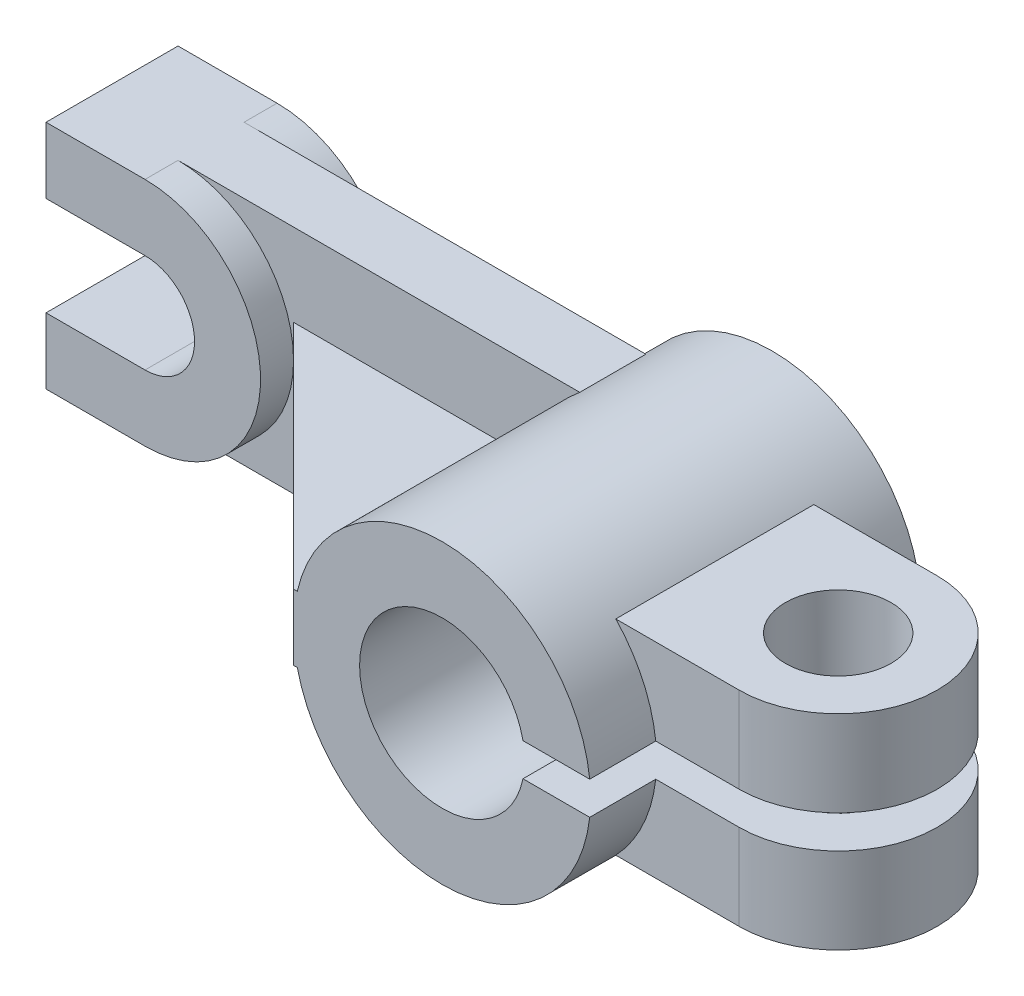
ISO-10303-21;
HEADER;
FILE_DESCRIPTION(('STEP AP214'),'2;1');
FILE_NAME('part.step','',(''),(''),'','','');
FILE_SCHEMA(('AUTOMOTIVE_DESIGN { 1 0 10303 214 1 1 1 1 }'));
ENDSEC;
DATA;
#1=APPLICATION_CONTEXT('core data for automotive mechanical design processes');
#2=APPLICATION_PROTOCOL_DEFINITION('international standard','automotive_design',2000,#1);
#3=PRODUCT_CONTEXT('',#1,'mechanical');
#4=PRODUCT('Part','Part','',(#3));
#5=PRODUCT_RELATED_PRODUCT_CATEGORY('part','',(#4));
#6=PRODUCT_DEFINITION_FORMATION('','',#4);
#7=PRODUCT_DEFINITION_CONTEXT('part definition',#1,'design');
#8=PRODUCT_DEFINITION('design','',#6,#7);
#9=PRODUCT_DEFINITION_SHAPE('','',#8);
#10=(LENGTH_UNIT() NAMED_UNIT(*) SI_UNIT(.MILLI.,.METRE.));
#11=(NAMED_UNIT(*) PLANE_ANGLE_UNIT() SI_UNIT($,.RADIAN.));
#12=(NAMED_UNIT(*) SI_UNIT($,.STERADIAN.) SOLID_ANGLE_UNIT());
#13=UNCERTAINTY_MEASURE_WITH_UNIT(LENGTH_MEASURE(1.E-05),#10,'distance_accuracy_value','');
#14=(GEOMETRIC_REPRESENTATION_CONTEXT(3) GLOBAL_UNCERTAINTY_ASSIGNED_CONTEXT((#13)) GLOBAL_UNIT_ASSIGNED_CONTEXT((#10,
#11,#12)) REPRESENTATION_CONTEXT('',''));
#15=CARTESIAN_POINT('',(0.,0.,0.));
#16=DIRECTION('',(0.,0.,1.));
#17=DIRECTION('',(1.,0.,0.));
#18=AXIS2_PLACEMENT_3D('',#15,#16,#17);
#19=CARTESIAN_POINT('',(-0.001000000000001,2.,35.));
#20=DIRECTION('',(0.,0.,-1.));
#21=DIRECTION('',(-1.,0.,0.));
#22=AXIS2_PLACEMENT_3D('',#19,#20,#21);
#23=PLANE('',#22);
#24=CARTESIAN_POINT('',(90.,17.5,35.));
#25=DIRECTION('',(0.,0.,-1.));
#26=DIRECTION('',(-1.,0.,0.));
#27=AXIS2_PLACEMENT_3D('',#24,#25,#26);
#28=CIRCLE('',#27,22.5);
#29=CARTESIAN_POINT('',(106.3095064303,33.,35.));
#30=VERTEX_POINT('',#29);
#31=CARTESIAN_POINT('',(112.360679774998,20.,35.));
#32=VERTEX_POINT('',#31);
#33=EDGE_CURVE('E422',#30,#32,#28,.T.);
#34=ORIENTED_EDGE('',*,*,#33,.T.);
#35=DIRECTION('',(1.,0.,0.));
#36=VECTOR('',#35,1.);
#37=CARTESIAN_POINT('',(-0.001000000000001,20.,35.));
#38=LINE('',#37,#36);
#39=CARTESIAN_POINT('',(125.,20.,35.));
#40=VERTEX_POINT('',#39);
#41=EDGE_CURVE('E418',#32,#40,#38,.T.);
#42=ORIENTED_EDGE('',*,*,#41,.T.);
#43=DIRECTION('',(0.,1.,0.));
#44=VECTOR('',#43,1.);
#45=CARTESIAN_POINT('',(125.,2.,35.));
#46=LINE('',#45,#44);
#47=CARTESIAN_POINT('',(125.,33.,35.));
#48=VERTEX_POINT('',#47);
#49=EDGE_CURVE('E447',#40,#48,#46,.T.);
#50=ORIENTED_EDGE('',*,*,#49,.T.);
#51=DIRECTION('',(-1.,0.,0.));
#52=VECTOR('',#51,1.);
#53=CARTESIAN_POINT('',(112.5,33.,35.));
#54=LINE('',#53,#52);
#55=EDGE_CURVE('E448',#48,#30,#54,.T.);
#56=ORIENTED_EDGE('',*,*,#55,.T.);
#57=EDGE_LOOP('',(#34,#42,#50,#56));
#58=FACE_BOUND('',#57,.T.);
#59=ADVANCED_FACE('F39',(#58),#23,.F.);
#60=CARTESIAN_POINT('',(-0.001000000000001,17.5,5.));
#61=DIRECTION('',(0.,0.,1.));
#62=DIRECTION('',(1.,0.,0.));
#63=AXIS2_PLACEMENT_3D('',#60,#61,#62);
#64=PLANE('',#63);
#65=DIRECTION('',(0.,1.,0.));
#66=VECTOR('',#65,1.);
#67=CARTESIAN_POINT('',(125.,2.,5.));
#68=LINE('',#67,#66);
#69=CARTESIAN_POINT('',(125.,20.,5.));
#70=VERTEX_POINT('',#69);
#71=CARTESIAN_POINT('',(125.,33.,5.));
#72=VERTEX_POINT('',#71);
#73=EDGE_CURVE('E461',#70,#72,#68,.T.);
#74=ORIENTED_EDGE('',*,*,#73,.F.);
#75=DIRECTION('',(-1.,0.,0.));
#76=VECTOR('',#75,1.);
#77=CARTESIAN_POINT('',(-0.001000000000001,20.,5.));
#78=LINE('',#77,#76);
#79=CARTESIAN_POINT('',(112.360679774998,20.,5.));
#80=VERTEX_POINT('',#79);
#81=EDGE_CURVE('E57',#70,#80,#78,.T.);
#82=ORIENTED_EDGE('',*,*,#81,.T.);
#83=CARTESIAN_POINT('',(90.,17.5,5.));
#84=DIRECTION('',(0.,0.,1.));
#85=DIRECTION('',(1.,0.,0.));
#86=AXIS2_PLACEMENT_3D('',#83,#84,#85);
#87=CIRCLE('',#86,22.5);
#88=CARTESIAN_POINT('',(106.3095064303,33.,5.));
#89=VERTEX_POINT('',#88);
#90=EDGE_CURVE('E426',#80,#89,#87,.T.);
#91=ORIENTED_EDGE('',*,*,#90,.T.);
#92=DIRECTION('',(1.,0.,0.));
#93=VECTOR('',#92,1.);
#94=CARTESIAN_POINT('',(125.,33.,5.));
#95=LINE('',#94,#93);
#96=EDGE_CURVE('E439',#89,#72,#95,.T.);
#97=ORIENTED_EDGE('',*,*,#96,.T.);
#98=EDGE_LOOP('',(#74,#82,#91,#97));
#99=FACE_BOUND('',#98,.T.);
#100=ADVANCED_FACE('F598',(#99),#64,.F.);
#101=CARTESIAN_POINT('',(125.,2.,20.));
#102=DIRECTION('',(0.,1.,0.));
#103=DIRECTION('',(0.,0.,1.));
#104=AXIS2_PLACEMENT_3D('',#101,#102,#103);
#105=CYLINDRICAL_SURFACE('',#104,15.);
#106=ORIENTED_EDGE('',*,*,#49,.F.);
#107=CARTESIAN_POINT('',(125.,20.,20.));
#108=DIRECTION('',(0.,1.,0.));
#109=DIRECTION('',(0.,0.,1.));
#110=AXIS2_PLACEMENT_3D('',#107,#108,#109);
#111=CIRCLE('',#110,15.);
#112=EDGE_CURVE('E413',#40,#70,#111,.T.);
#113=ORIENTED_EDGE('',*,*,#112,.T.);
#114=ORIENTED_EDGE('',*,*,#73,.T.);
#115=CARTESIAN_POINT('',(125.,33.,20.));
#116=DIRECTION('',(0.,-1.,0.));
#117=DIRECTION('',(0.,0.,-1.));
#118=AXIS2_PLACEMENT_3D('',#115,#116,#117);
#119=CIRCLE('',#118,15.);
#120=EDGE_CURVE('E452',#72,#48,#119,.T.);
#121=ORIENTED_EDGE('',*,*,#120,.T.);
#122=EDGE_LOOP('',(#106,#113,#114,#121));
#123=FACE_BOUND('',#122,.T.);
#124=ADVANCED_FACE('F581',(#123),#105,.T.);
#125=CARTESIAN_POINT('',(125.,2.,20.));
#126=DIRECTION('',(0.,1.,0.));
#127=DIRECTION('',(0.,0.,1.));
#128=AXIS2_PLACEMENT_3D('',#125,#126,#127);
#129=CYLINDRICAL_SURFACE('',#128,8.);
#130=CARTESIAN_POINT('',(125.,20.,20.));
#131=DIRECTION('',(0.,1.,0.));
#132=DIRECTION('',(0.,0.,1.));
#133=AXIS2_PLACEMENT_3D('',#130,#131,#132);
#134=CIRCLE('',#133,8.);
#135=CARTESIAN_POINT('',(125.,20.,28.));
#136=VERTEX_POINT('',#135);
#137=EDGE_CURVE('E43',#136,#136,#134,.T.);
#138=ORIENTED_EDGE('',*,*,#137,.F.);
#139=EDGE_LOOP('',(#138));
#140=FACE_BOUND('',#139,.T.);
#141=CARTESIAN_POINT('',(125.,33.,20.));
#142=DIRECTION('',(0.,-1.,0.));
#143=DIRECTION('',(0.,0.,-1.));
#144=AXIS2_PLACEMENT_3D('',#141,#142,#143);
#145=CIRCLE('',#144,8.);
#146=CARTESIAN_POINT('',(125.,33.,12.));
#147=VERTEX_POINT('',#146);
#148=EDGE_CURVE('E431',#147,#147,#145,.T.);
#149=ORIENTED_EDGE('',*,*,#148,.F.);
#150=EDGE_LOOP('',(#149));
#151=FACE_BOUND('',#150,.T.);
#152=ADVANCED_FACE('F578',(#140,#151),#129,.F.);
#153=CARTESIAN_POINT('',(90.,17.5,-5.));
#154=DIRECTION('',(0.,0.,1.));
#155=DIRECTION('',(1.,0.,0.));
#156=AXIS2_PLACEMENT_3D('',#153,#154,#155);
#157=CYLINDRICAL_SURFACE('',#156,22.5);
#158=DIRECTION('',(0.,0.,1.));
#159=VECTOR('',#158,1.);
#160=CARTESIAN_POINT('',(112.360679774998,20.,-5.));
#161=LINE('',#160,#159);
#162=CARTESIAN_POINT('',(112.360679774998,20.,45.));
#163=VERTEX_POINT('',#162);
#164=EDGE_CURVE('E272',#32,#163,#161,.T.);
#165=ORIENTED_EDGE('',*,*,#164,.F.);
#166=ORIENTED_EDGE('',*,*,#33,.F.);
#167=DIRECTION('',(0.,0.,1.));
#168=VECTOR('',#167,1.);
#169=CARTESIAN_POINT('',(106.3095064303,33.,-5.));
#170=LINE('',#169,#168);
#171=EDGE_CURVE('E427',#89,#30,#170,.T.);
#172=ORIENTED_EDGE('',*,*,#171,.F.);
#173=ORIENTED_EDGE('',*,*,#90,.F.);
#174=CARTESIAN_POINT('',(112.360679774998,20.,-5.));
#175=VERTEX_POINT('',#174);
#176=EDGE_CURVE('E267',#175,#80,#161,.T.);
#177=ORIENTED_EDGE('',*,*,#176,.F.);
#178=CARTESIAN_POINT('',(90.,17.5,-5.));
#179=DIRECTION('',(0.,0.,1.));
#180=DIRECTION('',(1.,0.,0.));
#181=AXIS2_PLACEMENT_3D('',#178,#179,#180);
#182=CIRCLE('',#181,22.5);
#183=CARTESIAN_POINT('',(112.360679774998,15.,-5.));
#184=VERTEX_POINT('',#183);
#185=EDGE_CURVE('E258',#175,#184,#182,.T.);
#186=ORIENTED_EDGE('',*,*,#185,.T.);
#187=DIRECTION('',(0.,0.,1.));
#188=VECTOR('',#187,1.);
#189=CARTESIAN_POINT('',(112.360679774998,15.,-5.));
#190=LINE('',#189,#188);
#191=CARTESIAN_POINT('',(112.360679774998,15.,5.));
#192=VERTEX_POINT('',#191);
#193=EDGE_CURVE('E236',#184,#192,#190,.T.);
#194=ORIENTED_EDGE('',*,*,#193,.T.);
#195=CARTESIAN_POINT('',(90.,17.5,5.));
#196=DIRECTION('',(0.,0.,1.));
#197=DIRECTION('',(1.,0.,0.));
#198=AXIS2_PLACEMENT_3D('',#195,#196,#197);
#199=CIRCLE('',#198,22.5);
#200=CARTESIAN_POINT('',(106.3095064303,2.,5.));
#201=VERTEX_POINT('',#200);
#202=EDGE_CURVE('E245',#201,#192,#199,.T.);
#203=ORIENTED_EDGE('',*,*,#202,.F.);
#204=DIRECTION('',(0.,0.,1.));
#205=VECTOR('',#204,1.);
#206=CARTESIAN_POINT('',(106.3095064303,2.,-5.));
#207=LINE('',#206,#205);
#208=CARTESIAN_POINT('',(106.3095064303,2.,35.));
#209=VERTEX_POINT('',#208);
#210=EDGE_CURVE('E253',#209,#201,#207,.F.);
#211=ORIENTED_EDGE('',*,*,#210,.F.);
#212=CARTESIAN_POINT('',(90.,17.5,35.));
#213=DIRECTION('',(0.,0.,-1.));
#214=DIRECTION('',(-1.,0.,0.));
#215=AXIS2_PLACEMENT_3D('',#212,#213,#214);
#216=CIRCLE('',#215,22.5);
#217=CARTESIAN_POINT('',(112.360679774998,15.,35.));
#218=VERTEX_POINT('',#217);
#219=EDGE_CURVE('E11',#209,#218,#216,.F.);
#220=ORIENTED_EDGE('',*,*,#219,.T.);
#221=CARTESIAN_POINT('',(112.360679774998,15.,45.));
#222=VERTEX_POINT('',#221);
#223=EDGE_CURVE('E261',#218,#222,#190,.T.);
#224=ORIENTED_EDGE('',*,*,#223,.T.);
#225=CARTESIAN_POINT('',(90.,17.5,45.));
#226=DIRECTION('',(0.,0.,1.));
#227=DIRECTION('',(1.,0.,0.));
#228=AXIS2_PLACEMENT_3D('',#225,#226,#227);
#229=CIRCLE('',#228,22.5);
#230=CARTESIAN_POINT('',(68.0625890315197,12.5,45.));
#231=VERTEX_POINT('',#230);
#232=EDGE_CURVE('E488',#231,#222,#229,.T.);
#233=ORIENTED_EDGE('',*,*,#232,.F.);
#234=DIRECTION('',(0.,0.,1.));
#235=VECTOR('',#234,1.);
#236=CARTESIAN_POINT('',(68.0625890315197,12.5,-5.));
#237=LINE('',#236,#235);
#238=CARTESIAN_POINT('',(68.0625890315197,12.5,10.));
#239=VERTEX_POINT('',#238);
#240=EDGE_CURVE('E500',#231,#239,#237,.F.);
#241=ORIENTED_EDGE('',*,*,#240,.T.);
#242=CARTESIAN_POINT('',(90.,17.5,10.));
#243=DIRECTION('',(0.,0.,-1.));
#244=DIRECTION('',(1.,0.,0.));
#245=AXIS2_PLACEMENT_3D('',#242,#243,#244);
#246=CIRCLE('',#245,22.5);
#247=CARTESIAN_POINT('',(75.857864376269,0.,10.));
#248=VERTEX_POINT('',#247);
#249=EDGE_CURVE('E368',#248,#239,#246,.T.);
#250=ORIENTED_EDGE('',*,*,#249,.F.);
#251=DIRECTION('',(0.,0.,-1.));
#252=VECTOR('',#251,1.);
#253=CARTESIAN_POINT('',(75.857864376269,0.,10.));
#254=LINE('',#253,#252);
#255=CARTESIAN_POINT('',(75.857864376269,0.,0.));
#256=VERTEX_POINT('',#255);
#257=EDGE_CURVE('E384',#248,#256,#254,.T.);
#258=ORIENTED_EDGE('',*,*,#257,.T.);
#259=CARTESIAN_POINT('',(90.,17.5,0.));
#260=DIRECTION('',(0.,0.,-1.));
#261=DIRECTION('',(1.,0.,0.));
#262=AXIS2_PLACEMENT_3D('',#259,#260,#261);
#263=CIRCLE('',#262,22.5);
#264=CARTESIAN_POINT('',(75.857864376269,35.,0.));
#265=VERTEX_POINT('',#264);
#266=EDGE_CURVE('E344',#256,#265,#263,.T.);
#267=ORIENTED_EDGE('',*,*,#266,.T.);
#268=DIRECTION('',(0.,0.,-1.));
#269=VECTOR('',#268,1.);
#270=CARTESIAN_POINT('',(75.857864376269,35.,10.));
#271=LINE('',#270,#269);
#272=CARTESIAN_POINT('',(75.857864376269,35.,10.));
#273=VERTEX_POINT('',#272);
#274=EDGE_CURVE('E49',#273,#265,#271,.T.);
#275=ORIENTED_EDGE('',*,*,#274,.F.);
#276=CARTESIAN_POINT('',(68.0625890315197,22.5,10.));
#277=VERTEX_POINT('',#276);
#278=EDGE_CURVE('E373',#277,#273,#246,.T.);
#279=ORIENTED_EDGE('',*,*,#278,.F.);
#280=DIRECTION('',(0.,0.,1.));
#281=VECTOR('',#280,1.);
#282=CARTESIAN_POINT('',(68.0625890315197,22.5,-5.));
#283=LINE('',#282,#281);
#284=CARTESIAN_POINT('',(68.0625890315197,22.5,45.));
#285=VERTEX_POINT('',#284);
#286=EDGE_CURVE('E509',#285,#277,#283,.F.);
#287=ORIENTED_EDGE('',*,*,#286,.F.);
#288=EDGE_CURVE('E489',#163,#285,#229,.T.);
#289=ORIENTED_EDGE('',*,*,#288,.F.);
#290=EDGE_LOOP('',(#165,#166,#172,#173,#177,#186,#194,#203,#211,#220,#224,#233,#241,#250,#258,
#267,#275,#279,#287,#289));
#291=FACE_BOUND('',#290,.T.);
#292=ADVANCED_FACE('F256',(#291),#157,.T.);
#293=CARTESIAN_POINT('',(90.,17.5,-5.));
#294=DIRECTION('',(0.,0.,1.));
#295=DIRECTION('',(1.,0.,0.));
#296=AXIS2_PLACEMENT_3D('',#293,#294,#295);
#297=CYLINDRICAL_SURFACE('',#296,12.5);
#298=DIRECTION('',(0.,0.,1.));
#299=VECTOR('',#298,1.);
#300=CARTESIAN_POINT('',(102.247448713916,20.,-5.));
#301=LINE('',#300,#299);
#302=CARTESIAN_POINT('',(102.247448713916,20.,-5.));
#303=VERTEX_POINT('',#302);
#304=CARTESIAN_POINT('',(102.247448713916,20.,45.));
#305=VERTEX_POINT('',#304);
#306=EDGE_CURVE('E273',#303,#305,#301,.T.);
#307=ORIENTED_EDGE('',*,*,#306,.T.);
#308=CARTESIAN_POINT('',(90.,17.5,45.));
#309=DIRECTION('',(0.,0.,-1.));
#310=DIRECTION('',(1.,0.,0.));
#311=AXIS2_PLACEMENT_3D('',#308,#309,#310);
#312=CIRCLE('',#311,12.5);
#313=CARTESIAN_POINT('',(102.247448713916,15.,45.));
#314=VERTEX_POINT('',#313);
#315=EDGE_CURVE('E481',#314,#305,#312,.T.);
#316=ORIENTED_EDGE('',*,*,#315,.F.);
#317=DIRECTION('',(0.,0.,1.));
#318=VECTOR('',#317,1.);
#319=CARTESIAN_POINT('',(102.247448713916,15.,-5.));
#320=LINE('',#319,#318);
#321=CARTESIAN_POINT('',(102.247448713916,15.,-5.));
#322=VERTEX_POINT('',#321);
#323=EDGE_CURVE('E260',#322,#314,#320,.T.);
#324=ORIENTED_EDGE('',*,*,#323,.F.);
#325=CARTESIAN_POINT('',(90.,17.5,-5.));
#326=DIRECTION('',(0.,0.,-1.));
#327=DIRECTION('',(1.,0.,0.));
#328=AXIS2_PLACEMENT_3D('',#325,#326,#327);
#329=CIRCLE('',#328,12.5);
#330=EDGE_CURVE('E520',#322,#303,#329,.T.);
#331=ORIENTED_EDGE('',*,*,#330,.T.);
#332=EDGE_LOOP('',(#307,#316,#324,#331));
#333=FACE_BOUND('',#332,.T.);
#334=ADVANCED_FACE('F536',(#333),#297,.F.);
#335=CARTESIAN_POINT('',(102.247448713916,15.,-5.));
#336=DIRECTION('',(0.,1.,0.));
#337=DIRECTION('',(0.,0.,1.));
#338=AXIS2_PLACEMENT_3D('',#335,#336,#337);
#339=PLANE('',#338);
#340=ORIENTED_EDGE('',*,*,#323,.T.);
#341=DIRECTION('',(-1.,0.,0.));
#342=VECTOR('',#341,1.);
#343=CARTESIAN_POINT('',(112.360679774998,15.,45.));
#344=LINE('',#343,#342);
#345=EDGE_CURVE('E492',#222,#314,#344,.T.);
#346=ORIENTED_EDGE('',*,*,#345,.F.);
#347=ORIENTED_EDGE('',*,*,#223,.F.);
#348=DIRECTION('',(-1.,0.,0.));
#349=VECTOR('',#348,1.);
#350=CARTESIAN_POINT('',(-0.00100000000000635,14.9999999999999,35.));
#351=LINE('',#350,#349);
#352=CARTESIAN_POINT('',(125.,15.,35.));
#353=VERTEX_POINT('',#352);
#354=EDGE_CURVE('E65',#353,#218,#351,.T.);
#355=ORIENTED_EDGE('',*,*,#354,.F.);
#356=CARTESIAN_POINT('',(125.,15.,20.));
#357=DIRECTION('',(0.,-1.,0.));
#358=DIRECTION('',(1.,0.,0.));
#359=AXIS2_PLACEMENT_3D('',#356,#357,#358);
#360=CIRCLE('',#359,15.);
#361=CARTESIAN_POINT('',(125.,15.,5.));
#362=VERTEX_POINT('',#361);
#363=EDGE_CURVE('E238',#362,#353,#360,.T.);
#364=ORIENTED_EDGE('',*,*,#363,.F.);
#365=DIRECTION('',(1.,0.,0.));
#366=VECTOR('',#365,1.);
#367=CARTESIAN_POINT('',(-0.000999999999999972,14.9999999999999,5.));
#368=LINE('',#367,#366);
#369=EDGE_CURVE('E229',#192,#362,#368,.T.);
#370=ORIENTED_EDGE('',*,*,#369,.F.);
#371=ORIENTED_EDGE('',*,*,#193,.F.);
#372=DIRECTION('',(-1.,0.,0.));
#373=VECTOR('',#372,1.);
#374=CARTESIAN_POINT('',(102.247448713916,15.,-5.));
#375=LINE('',#374,#373);
#376=EDGE_CURVE('E277',#184,#322,#375,.T.);
#377=ORIENTED_EDGE('',*,*,#376,.T.);
#378=EDGE_LOOP('',(#340,#346,#347,#355,#364,#370,#371,#377));
#379=FACE_BOUND('',#378,.T.);
#380=CARTESIAN_POINT('',(125.,15.,20.));
#381=DIRECTION('',(0.,-1.,0.));
#382=DIRECTION('',(1.,0.,0.));
#383=AXIS2_PLACEMENT_3D('',#380,#381,#382);
#384=CIRCLE('',#383,8.);
#385=CARTESIAN_POINT('',(133.,15.,20.));
#386=VERTEX_POINT('',#385);
#387=EDGE_CURVE('E401',#386,#386,#384,.T.);
#388=ORIENTED_EDGE('',*,*,#387,.T.);
#389=EDGE_LOOP('',(#388));
#390=FACE_BOUND('',#389,.T.);
#391=ADVANCED_FACE('F232',(#379,#390),#339,.T.);
#392=CARTESIAN_POINT('',(102.247448713916,20.,-5.));
#393=DIRECTION('',(0.,-1.,0.));
#394=DIRECTION('',(0.,0.,-1.));
#395=AXIS2_PLACEMENT_3D('',#392,#393,#394);
#396=PLANE('',#395);
#397=ORIENTED_EDGE('',*,*,#176,.T.);
#398=ORIENTED_EDGE('',*,*,#81,.F.);
#399=ORIENTED_EDGE('',*,*,#112,.F.);
#400=ORIENTED_EDGE('',*,*,#41,.F.);
#401=ORIENTED_EDGE('',*,*,#164,.T.);
#402=DIRECTION('',(1.,0.,0.));
#403=VECTOR('',#402,1.);
#404=CARTESIAN_POINT('',(102.247448713916,20.,45.));
#405=LINE('',#404,#403);
#406=EDGE_CURVE('E484',#305,#163,#405,.T.);
#407=ORIENTED_EDGE('',*,*,#406,.F.);
#408=ORIENTED_EDGE('',*,*,#306,.F.);
#409=DIRECTION('',(1.,0.,0.));
#410=VECTOR('',#409,1.);
#411=CARTESIAN_POINT('',(102.247448713916,20.,-5.));
#412=LINE('',#411,#410);
#413=EDGE_CURVE('E523',#303,#175,#412,.T.);
#414=ORIENTED_EDGE('',*,*,#413,.T.);
#415=EDGE_LOOP('',(#397,#398,#399,#400,#401,#407,#408,#414));
#416=FACE_BOUND('',#415,.T.);
#417=ORIENTED_EDGE('',*,*,#137,.T.);
#418=EDGE_LOOP('',(#417));
#419=FACE_BOUND('',#418,.T.);
#420=ADVANCED_FACE('F539',(#416,#419),#396,.T.);
#421=CARTESIAN_POINT('',(90.,17.5,10.));
#422=DIRECTION('',(0.,0.,1.));
#423=DIRECTION('',(1.,0.,0.));
#424=AXIS2_PLACEMENT_3D('',#421,#422,#423);
#425=PLANE('',#424);
#426=DIRECTION('',(-1.,0.,0.));
#427=VECTOR('',#426,1.);
#428=CARTESIAN_POINT('',(90.,22.5,10.));
#429=LINE('',#428,#427);
#430=CARTESIAN_POINT('',(32.5,22.5,10.));
#431=VERTEX_POINT('',#430);
#432=EDGE_CURVE('E512',#277,#431,#429,.T.);
#433=ORIENTED_EDGE('',*,*,#432,.F.);
#434=ORIENTED_EDGE('',*,*,#278,.T.);
#435=DIRECTION('',(-1.,0.,0.));
#436=VECTOR('',#435,1.);
#437=CARTESIAN_POINT('',(75.857864376269,35.,10.));
#438=LINE('',#437,#436);
#439=CARTESIAN_POINT('',(15.,35.,10.));
#440=VERTEX_POINT('',#439);
#441=EDGE_CURVE('E372',#273,#440,#438,.T.);
#442=ORIENTED_EDGE('',*,*,#441,.T.);
#443=CARTESIAN_POINT('',(15.,17.5,10.));
#444=DIRECTION('',(0.,0.,-1.));
#445=DIRECTION('',(1.,0.,0.));
#446=AXIS2_PLACEMENT_3D('',#443,#444,#445);
#447=CIRCLE('',#446,17.5);
#448=CARTESIAN_POINT('',(32.5,17.5,10.));
#449=VERTEX_POINT('',#448);
#450=EDGE_CURVE('E377',#440,#449,#447,.T.);
#451=ORIENTED_EDGE('',*,*,#450,.T.);
#452=DIRECTION('',(0.,-1.,0.));
#453=VECTOR('',#452,1.);
#454=CARTESIAN_POINT('',(32.5,17.5,10.));
#455=LINE('',#454,#453);
#456=EDGE_CURVE('E519',#431,#449,#455,.T.);
#457=ORIENTED_EDGE('',*,*,#456,.F.);
#458=EDGE_LOOP('',(#433,#434,#442,#451,#457));
#459=FACE_BOUND('',#458,.T.);
#460=ADVANCED_FACE('F554',(#459),#425,.T.);
#461=CARTESIAN_POINT('',(75.857864376269,35.,10.));
#462=DIRECTION('',(0.,-1.,0.));
#463=DIRECTION('',(1.,0.,0.));
#464=AXIS2_PLACEMENT_3D('',#461,#462,#463);
#465=PLANE('',#464);
#466=DIRECTION('',(-1.,0.,0.));
#467=VECTOR('',#466,1.);
#468=CARTESIAN_POINT('',(75.857864376269,35.,0.));
#469=LINE('',#468,#467);
#470=CARTESIAN_POINT('',(15.,35.,0.));
#471=VERTEX_POINT('',#470);
#472=EDGE_CURVE('E387',#265,#471,#469,.T.);
#473=ORIENTED_EDGE('',*,*,#472,.T.);
#474=DIRECTION('',(0.,0.,1.));
#475=VECTOR('',#474,1.);
#476=CARTESIAN_POINT('',(15.,35.,-5.));
#477=LINE('',#476,#475);
#478=CARTESIAN_POINT('',(15.,35.,-5.));
#479=VERTEX_POINT('',#478);
#480=EDGE_CURVE('E364',#479,#471,#477,.T.);
#481=ORIENTED_EDGE('',*,*,#480,.F.);
#482=DIRECTION('',(-1.,0.,0.));
#483=VECTOR('',#482,1.);
#484=CARTESIAN_POINT('',(0.,35.,-5.));
#485=LINE('',#484,#483);
#486=CARTESIAN_POINT('',(0.,35.,-5.));
#487=VERTEX_POINT('',#486);
#488=EDGE_CURVE('E312',#479,#487,#485,.T.);
#489=ORIENTED_EDGE('',*,*,#488,.T.);
#490=DIRECTION('',(0.,0.,1.));
#491=VECTOR('',#490,1.);
#492=CARTESIAN_POINT('',(0.,35.,-5.));
#493=LINE('',#492,#491);
#494=CARTESIAN_POINT('',(0.,35.,15.));
#495=VERTEX_POINT('',#494);
#496=EDGE_CURVE('E361',#487,#495,#493,.T.);
#497=ORIENTED_EDGE('',*,*,#496,.T.);
#498=DIRECTION('',(-1.,0.,0.));
#499=VECTOR('',#498,1.);
#500=CARTESIAN_POINT('',(0.,35.,15.));
#501=LINE('',#500,#499);
#502=CARTESIAN_POINT('',(15.,35.,15.));
#503=VERTEX_POINT('',#502);
#504=EDGE_CURVE('E281',#503,#495,#501,.T.);
#505=ORIENTED_EDGE('',*,*,#504,.F.);
#506=EDGE_CURVE('E339',#440,#503,#477,.T.);
#507=ORIENTED_EDGE('',*,*,#506,.F.);
#508=ORIENTED_EDGE('',*,*,#441,.F.);
#509=ORIENTED_EDGE('',*,*,#274,.T.);
#510=EDGE_LOOP('',(#473,#481,#489,#497,#505,#507,#508,#509));
#511=FACE_BOUND('',#510,.T.);
#512=ADVANCED_FACE('F41',(#511),#465,.F.);
#513=CARTESIAN_POINT('',(15.,0.,10.));
#514=DIRECTION('',(0.,1.,0.));
#515=DIRECTION('',(-1.,0.,0.));
#516=AXIS2_PLACEMENT_3D('',#513,#514,#515);
#517=PLANE('',#516);
#518=DIRECTION('',(1.,0.,0.));
#519=VECTOR('',#518,1.);
#520=CARTESIAN_POINT('',(15.,0.,0.));
#521=LINE('',#520,#519);
#522=CARTESIAN_POINT('',(15.,0.,0.));
#523=VERTEX_POINT('',#522);
#524=EDGE_CURVE('E393',#523,#256,#521,.T.);
#525=ORIENTED_EDGE('',*,*,#524,.T.);
#526=ORIENTED_EDGE('',*,*,#257,.F.);
#527=DIRECTION('',(1.,0.,0.));
#528=VECTOR('',#527,1.);
#529=CARTESIAN_POINT('',(15.,0.,10.));
#530=LINE('',#529,#528);
#531=CARTESIAN_POINT('',(15.,0.,10.));
#532=VERTEX_POINT('',#531);
#533=EDGE_CURVE('E381',#532,#248,#530,.T.);
#534=ORIENTED_EDGE('',*,*,#533,.F.);
#535=DIRECTION('',(0.,0.,1.));
#536=VECTOR('',#535,1.);
#537=CARTESIAN_POINT('',(15.,0.,-5.));
#538=LINE('',#537,#536);
#539=CARTESIAN_POINT('',(15.,0.,15.));
#540=VERTEX_POINT('',#539);
#541=EDGE_CURVE('E345',#532,#540,#538,.T.);
#542=ORIENTED_EDGE('',*,*,#541,.T.);
#543=DIRECTION('',(1.,0.,0.));
#544=VECTOR('',#543,1.);
#545=CARTESIAN_POINT('',(0.,0.,15.));
#546=LINE('',#545,#544);
#547=CARTESIAN_POINT('',(0.,0.,15.));
#548=VERTEX_POINT('',#547);
#549=EDGE_CURVE('E305',#548,#540,#546,.T.);
#550=ORIENTED_EDGE('',*,*,#549,.F.);
#551=DIRECTION('',(0.,0.,1.));
#552=VECTOR('',#551,1.);
#553=CARTESIAN_POINT('',(0.,0.,-5.));
#554=LINE('',#553,#552);
#555=CARTESIAN_POINT('',(0.,0.,-5.));
#556=VERTEX_POINT('',#555);
#557=EDGE_CURVE('E346',#556,#548,#554,.T.);
#558=ORIENTED_EDGE('',*,*,#557,.F.);
#559=DIRECTION('',(1.,0.,0.));
#560=VECTOR('',#559,1.);
#561=CARTESIAN_POINT('',(0.,0.,-5.));
#562=LINE('',#561,#560);
#563=CARTESIAN_POINT('',(15.,0.,-5.));
#564=VERTEX_POINT('',#563);
#565=EDGE_CURVE('E335',#556,#564,#562,.T.);
#566=ORIENTED_EDGE('',*,*,#565,.T.);
#567=EDGE_CURVE('E340',#564,#523,#538,.T.);
#568=ORIENTED_EDGE('',*,*,#567,.T.);
#569=EDGE_LOOP('',(#525,#526,#534,#542,#550,#558,#566,#568));
#570=FACE_BOUND('',#569,.T.);
#571=ADVANCED_FACE('F838',(#570),#517,.F.);
#572=CARTESIAN_POINT('',(32.5,12.5,10.));
#573=VERTEX_POINT('',#572);
#574=EDGE_CURVE('E515',#449,#573,#455,.T.);
#575=ORIENTED_EDGE('',*,*,#574,.F.);
#576=EDGE_CURVE('E376',#449,#532,#447,.T.);
#577=ORIENTED_EDGE('',*,*,#576,.T.);
#578=ORIENTED_EDGE('',*,*,#533,.T.);
#579=ORIENTED_EDGE('',*,*,#249,.T.);
#580=DIRECTION('',(-1.,0.,0.));
#581=VECTOR('',#580,1.);
#582=CARTESIAN_POINT('',(90.,12.5,10.));
#583=LINE('',#582,#581);
#584=EDGE_CURVE('E506',#239,#573,#583,.T.);
#585=ORIENTED_EDGE('',*,*,#584,.T.);
#586=EDGE_LOOP('',(#575,#577,#578,#579,#585));
#587=FACE_BOUND('',#586,.T.);
#588=ADVANCED_FACE('F827',(#587),#425,.T.);
#589=CARTESIAN_POINT('',(90.,17.5,0.));
#590=DIRECTION('',(0.,0.,1.));
#591=DIRECTION('',(1.,0.,0.));
#592=AXIS2_PLACEMENT_3D('',#589,#590,#591);
#593=PLANE('',#592);
#594=ORIENTED_EDGE('',*,*,#472,.F.);
#595=ORIENTED_EDGE('',*,*,#266,.F.);
#596=ORIENTED_EDGE('',*,*,#524,.F.);
#597=CARTESIAN_POINT('',(15.,17.5,0.));
#598=DIRECTION('',(0.,0.,-1.));
#599=DIRECTION('',(1.,0.,0.));
#600=AXIS2_PLACEMENT_3D('',#597,#598,#599);
#601=CIRCLE('',#600,17.5);
#602=EDGE_CURVE('E390',#471,#523,#601,.T.);
#603=ORIENTED_EDGE('',*,*,#602,.F.);
#604=EDGE_LOOP('',(#594,#595,#596,#603));
#605=FACE_BOUND('',#604,.T.);
#606=ADVANCED_FACE('F817',(#605),#593,.F.);
#607=CARTESIAN_POINT('',(15.,17.5,-5.));
#608=DIRECTION('',(0.,0.,1.));
#609=DIRECTION('',(1.,0.,0.));
#610=AXIS2_PLACEMENT_3D('',#607,#608,#609);
#611=CYLINDRICAL_SURFACE('',#610,17.5);
#612=ORIENTED_EDGE('',*,*,#602,.T.);
#613=ORIENTED_EDGE('',*,*,#567,.F.);
#614=CARTESIAN_POINT('',(15.,17.5,-5.));
#615=DIRECTION('',(0.,0.,1.));
#616=DIRECTION('',(1.,0.,0.));
#617=AXIS2_PLACEMENT_3D('',#614,#615,#616);
#618=CIRCLE('',#617,17.5);
#619=EDGE_CURVE('E309',#564,#479,#618,.T.);
#620=ORIENTED_EDGE('',*,*,#619,.T.);
#621=ORIENTED_EDGE('',*,*,#480,.T.);
#622=EDGE_LOOP('',(#612,#613,#620,#621));
#623=FACE_BOUND('',#622,.T.);
#624=ADVANCED_FACE('F805',(#623),#611,.T.);
#625=ORIENTED_EDGE('',*,*,#541,.F.);
#626=ORIENTED_EDGE('',*,*,#576,.F.);
#627=ORIENTED_EDGE('',*,*,#450,.F.);
#628=ORIENTED_EDGE('',*,*,#506,.T.);
#629=CARTESIAN_POINT('',(15.,17.5,15.));
#630=DIRECTION('',(0.,0.,1.));
#631=DIRECTION('',(1.,0.,0.));
#632=AXIS2_PLACEMENT_3D('',#629,#630,#631);
#633=CIRCLE('',#632,17.5);
#634=EDGE_CURVE('E265',#540,#503,#633,.T.);
#635=ORIENTED_EDGE('',*,*,#634,.F.);
#636=EDGE_LOOP('',(#625,#626,#627,#628,#635));
#637=FACE_BOUND('',#636,.T.);
#638=ADVANCED_FACE('F799',(#637),#611,.T.);
#639=CARTESIAN_POINT('',(0.,10.,-5.));
#640=DIRECTION('',(-1.,0.,0.));
#641=DIRECTION('',(0.,-1.,0.));
#642=AXIS2_PLACEMENT_3D('',#639,#640,#641);
#643=PLANE('',#642);
#644=ORIENTED_EDGE('',*,*,#557,.T.);
#645=DIRECTION('',(0.,-1.,0.));
#646=VECTOR('',#645,1.);
#647=CARTESIAN_POINT('',(0.,10.,15.));
#648=LINE('',#647,#646);
#649=CARTESIAN_POINT('',(0.,10.,15.));
#650=VERTEX_POINT('',#649);
#651=EDGE_CURVE('E301',#650,#548,#648,.T.);
#652=ORIENTED_EDGE('',*,*,#651,.F.);
#653=DIRECTION('',(0.,0.,1.));
#654=VECTOR('',#653,1.);
#655=CARTESIAN_POINT('',(0.,10.,-5.));
#656=LINE('',#655,#654);
#657=CARTESIAN_POINT('',(0.,10.,-5.));
#658=VERTEX_POINT('',#657);
#659=EDGE_CURVE('E349',#658,#650,#656,.T.);
#660=ORIENTED_EDGE('',*,*,#659,.F.);
#661=DIRECTION('',(0.,-1.,0.));
#662=VECTOR('',#661,1.);
#663=CARTESIAN_POINT('',(0.,10.,-5.));
#664=LINE('',#663,#662);
#665=EDGE_CURVE('E331',#658,#556,#664,.T.);
#666=ORIENTED_EDGE('',*,*,#665,.T.);
#667=EDGE_LOOP('',(#644,#652,#660,#666));
#668=FACE_BOUND('',#667,.T.);
#669=ADVANCED_FACE('F804',(#668),#643,.T.);
#670=CARTESIAN_POINT('',(15.,10.,-5.));
#671=DIRECTION('',(0.,1.,0.));
#672=DIRECTION('',(-1.,0.,0.));
#673=AXIS2_PLACEMENT_3D('',#670,#671,#672);
#674=PLANE('',#673);
#675=ORIENTED_EDGE('',*,*,#659,.T.);
#676=DIRECTION('',(-1.,0.,0.));
#677=VECTOR('',#676,1.);
#678=CARTESIAN_POINT('',(15.,10.,15.));
#679=LINE('',#678,#677);
#680=CARTESIAN_POINT('',(15.,10.,15.));
#681=VERTEX_POINT('',#680);
#682=EDGE_CURVE('E297',#681,#650,#679,.T.);
#683=ORIENTED_EDGE('',*,*,#682,.F.);
#684=DIRECTION('',(0.,0.,1.));
#685=VECTOR('',#684,1.);
#686=CARTESIAN_POINT('',(15.,10.,-5.));
#687=LINE('',#686,#685);
#688=CARTESIAN_POINT('',(15.,10.,-5.));
#689=VERTEX_POINT('',#688);
#690=EDGE_CURVE('E352',#689,#681,#687,.T.);
#691=ORIENTED_EDGE('',*,*,#690,.F.);
#692=DIRECTION('',(-1.,0.,0.));
#693=VECTOR('',#692,1.);
#694=CARTESIAN_POINT('',(15.,10.,-5.));
#695=LINE('',#694,#693);
#696=EDGE_CURVE('E327',#689,#658,#695,.T.);
#697=ORIENTED_EDGE('',*,*,#696,.T.);
#698=EDGE_LOOP('',(#675,#683,#691,#697));
#699=FACE_BOUND('',#698,.T.);
#700=ADVANCED_FACE('F789',(#699),#674,.T.);
#701=CARTESIAN_POINT('',(15.,17.5,-5.));
#702=DIRECTION('',(0.,0.,1.));
#703=DIRECTION('',(1.,0.,0.));
#704=AXIS2_PLACEMENT_3D('',#701,#702,#703);
#705=CYLINDRICAL_SURFACE('',#704,7.5);
#706=CARTESIAN_POINT('',(15.,17.5,-5.));
#707=DIRECTION('',(0.,0.,-1.));
#708=DIRECTION('',(1.,0.,0.));
#709=AXIS2_PLACEMENT_3D('',#706,#707,#708);
#710=CIRCLE('',#709,7.5);
#711=CARTESIAN_POINT('',(15.,25.,-5.));
#712=VERTEX_POINT('',#711);
#713=EDGE_CURVE('E324',#712,#689,#710,.T.);
#714=ORIENTED_EDGE('',*,*,#713,.T.);
#715=ORIENTED_EDGE('',*,*,#690,.T.);
#716=CARTESIAN_POINT('',(15.,17.5,15.));
#717=DIRECTION('',(0.,0.,-1.));
#718=DIRECTION('',(1.,0.,0.));
#719=AXIS2_PLACEMENT_3D('',#716,#717,#718);
#720=CIRCLE('',#719,7.5);
#721=CARTESIAN_POINT('',(15.,25.,15.));
#722=VERTEX_POINT('',#721);
#723=EDGE_CURVE('E293',#722,#681,#720,.T.);
#724=ORIENTED_EDGE('',*,*,#723,.F.);
#725=DIRECTION('',(0.,0.,1.));
#726=VECTOR('',#725,1.);
#727=CARTESIAN_POINT('',(15.,25.,-5.));
#728=LINE('',#727,#726);
#729=EDGE_CURVE('E355',#712,#722,#728,.T.);
#730=ORIENTED_EDGE('',*,*,#729,.F.);
#731=EDGE_LOOP('',(#714,#715,#724,#730));
#732=FACE_BOUND('',#731,.T.);
#733=ADVANCED_FACE('F783',(#732),#705,.F.);
#734=CARTESIAN_POINT('',(15.,25.,-5.));
#735=DIRECTION('',(0.,-1.,0.));
#736=DIRECTION('',(0.,0.,-1.));
#737=AXIS2_PLACEMENT_3D('',#734,#735,#736);
#738=PLANE('',#737);
#739=ORIENTED_EDGE('',*,*,#729,.T.);
#740=DIRECTION('',(1.,0.,0.));
#741=VECTOR('',#740,1.);
#742=CARTESIAN_POINT('',(15.,25.,15.));
#743=LINE('',#742,#741);
#744=CARTESIAN_POINT('',(0.,25.,15.));
#745=VERTEX_POINT('',#744);
#746=EDGE_CURVE('E289',#745,#722,#743,.T.);
#747=ORIENTED_EDGE('',*,*,#746,.F.);
#748=DIRECTION('',(0.,0.,1.));
#749=VECTOR('',#748,1.);
#750=CARTESIAN_POINT('',(0.,25.,-5.));
#751=LINE('',#750,#749);
#752=CARTESIAN_POINT('',(0.,25.,-5.));
#753=VERTEX_POINT('',#752);
#754=EDGE_CURVE('E358',#753,#745,#751,.T.);
#755=ORIENTED_EDGE('',*,*,#754,.F.);
#756=DIRECTION('',(1.,0.,0.));
#757=VECTOR('',#756,1.);
#758=CARTESIAN_POINT('',(15.,25.,-5.));
#759=LINE('',#758,#757);
#760=EDGE_CURVE('E320',#753,#712,#759,.T.);
#761=ORIENTED_EDGE('',*,*,#760,.T.);
#762=EDGE_LOOP('',(#739,#747,#755,#761));
#763=FACE_BOUND('',#762,.T.);
#764=ADVANCED_FACE('F788',(#763),#738,.T.);
#765=CARTESIAN_POINT('',(0.,25.,-5.));
#766=DIRECTION('',(-1.,0.,0.));
#767=DIRECTION('',(0.,-1.,0.));
#768=AXIS2_PLACEMENT_3D('',#765,#766,#767);
#769=PLANE('',#768);
#770=ORIENTED_EDGE('',*,*,#754,.T.);
#771=DIRECTION('',(0.,-1.,0.));
#772=VECTOR('',#771,1.);
#773=CARTESIAN_POINT('',(0.,25.,15.));
#774=LINE('',#773,#772);
#775=EDGE_CURVE('E285',#495,#745,#774,.T.);
#776=ORIENTED_EDGE('',*,*,#775,.F.);
#777=ORIENTED_EDGE('',*,*,#496,.F.);
#778=DIRECTION('',(0.,-1.,0.));
#779=VECTOR('',#778,1.);
#780=CARTESIAN_POINT('',(0.,25.,-5.));
#781=LINE('',#780,#779);
#782=EDGE_CURVE('E316',#487,#753,#781,.T.);
#783=ORIENTED_EDGE('',*,*,#782,.T.);
#784=EDGE_LOOP('',(#770,#776,#777,#783));
#785=FACE_BOUND('',#784,.T.);
#786=ADVANCED_FACE('F775',(#785),#769,.T.);
#787=CARTESIAN_POINT('',(15.,17.5,-5.));
#788=DIRECTION('',(0.,0.,1.));
#789=DIRECTION('',(1.,0.,0.));
#790=AXIS2_PLACEMENT_3D('',#787,#788,#789);
#791=PLANE('',#790);
#792=ORIENTED_EDGE('',*,*,#488,.F.);
#793=ORIENTED_EDGE('',*,*,#619,.F.);
#794=ORIENTED_EDGE('',*,*,#565,.F.);
#795=ORIENTED_EDGE('',*,*,#665,.F.);
#796=ORIENTED_EDGE('',*,*,#696,.F.);
#797=ORIENTED_EDGE('',*,*,#713,.F.);
#798=ORIENTED_EDGE('',*,*,#760,.F.);
#799=ORIENTED_EDGE('',*,*,#782,.F.);
#800=EDGE_LOOP('',(#792,#793,#794,#795,#796,#797,#798,#799));
#801=FACE_BOUND('',#800,.T.);
#802=ADVANCED_FACE('F770',(#801),#791,.F.);
#803=CARTESIAN_POINT('',(15.,17.5,15.));
#804=DIRECTION('',(0.,0.,1.));
#805=DIRECTION('',(1.,0.,0.));
#806=AXIS2_PLACEMENT_3D('',#803,#804,#805);
#807=PLANE('',#806);
#808=ORIENTED_EDGE('',*,*,#634,.T.);
#809=ORIENTED_EDGE('',*,*,#504,.T.);
#810=ORIENTED_EDGE('',*,*,#775,.T.);
#811=ORIENTED_EDGE('',*,*,#746,.T.);
#812=ORIENTED_EDGE('',*,*,#723,.T.);
#813=ORIENTED_EDGE('',*,*,#682,.T.);
#814=ORIENTED_EDGE('',*,*,#651,.T.);
#815=ORIENTED_EDGE('',*,*,#549,.T.);
#816=EDGE_LOOP('',(#808,#809,#810,#811,#812,#813,#814,#815));
#817=FACE_BOUND('',#816,.T.);
#818=ADVANCED_FACE('F762',(#817),#807,.T.);
#819=CARTESIAN_POINT('',(90.,17.5,-5.));
#820=DIRECTION('',(0.,0.,1.));
#821=DIRECTION('',(1.,0.,0.));
#822=AXIS2_PLACEMENT_3D('',#819,#820,#821);
#823=PLANE('',#822);
#824=ORIENTED_EDGE('',*,*,#376,.F.);
#825=ORIENTED_EDGE('',*,*,#185,.F.);
#826=ORIENTED_EDGE('',*,*,#413,.F.);
#827=ORIENTED_EDGE('',*,*,#330,.F.);
#828=EDGE_LOOP('',(#824,#825,#826,#827));
#829=FACE_BOUND('',#828,.T.);
#830=ADVANCED_FACE('F532',(#829),#823,.F.);
#831=CARTESIAN_POINT('',(56.1803398874989,22.5,20.));
#832=DIRECTION('',(0.,1.,0.));
#833=DIRECTION('',(-1.,0.,0.));
#834=AXIS2_PLACEMENT_3D('',#831,#832,#833);
#835=PLANE('',#834);
#836=DIRECTION('',(-1.,0.,0.));
#837=VECTOR('',#836,1.);
#838=CARTESIAN_POINT('',(56.1803398874989,22.5,45.));
#839=LINE('',#838,#837);
#840=CARTESIAN_POINT('',(67.5,22.5,45.));
#841=VERTEX_POINT('',#840);
#842=EDGE_CURVE('E478',#285,#841,#839,.T.);
#843=ORIENTED_EDGE('',*,*,#842,.F.);
#844=ORIENTED_EDGE('',*,*,#286,.T.);
#845=ORIENTED_EDGE('',*,*,#432,.T.);
#846=DIRECTION('',(0.707106781186548,0.,0.707106781186547));
#847=VECTOR('',#846,1.);
#848=CARTESIAN_POINT('',(32.5,22.5,10.));
#849=LINE('',#848,#847);
#850=EDGE_CURVE('E496',#431,#841,#849,.T.);
#851=ORIENTED_EDGE('',*,*,#850,.T.);
#852=EDGE_LOOP('',(#843,#844,#845,#851));
#853=FACE_BOUND('',#852,.T.);
#854=ADVANCED_FACE('F551',(#853),#835,.T.);
#855=CARTESIAN_POINT('',(56.1803398874989,12.5,20.));
#856=DIRECTION('',(0.,1.,0.));
#857=DIRECTION('',(-1.,0.,0.));
#858=AXIS2_PLACEMENT_3D('',#855,#856,#857);
#859=PLANE('',#858);
#860=ORIENTED_EDGE('',*,*,#240,.F.);
#861=DIRECTION('',(-1.,0.,0.));
#862=VECTOR('',#861,1.);
#863=CARTESIAN_POINT('',(56.1803398874989,12.5,45.));
#864=LINE('',#863,#862);
#865=CARTESIAN_POINT('',(67.5,12.5,45.));
#866=VERTEX_POINT('',#865);
#867=EDGE_CURVE('E474',#231,#866,#864,.T.);
#868=ORIENTED_EDGE('',*,*,#867,.T.);
#869=DIRECTION('',(0.707106781186548,0.,0.707106781186547));
#870=VECTOR('',#869,1.);
#871=CARTESIAN_POINT('',(32.5,12.5,10.));
#872=LINE('',#871,#870);
#873=EDGE_CURVE('E495',#573,#866,#872,.T.);
#874=ORIENTED_EDGE('',*,*,#873,.F.);
#875=ORIENTED_EDGE('',*,*,#584,.F.);
#876=EDGE_LOOP('',(#860,#868,#874,#875));
#877=FACE_BOUND('',#876,.T.);
#878=ADVANCED_FACE('F568',(#877),#859,.F.);
#879=CARTESIAN_POINT('',(32.5,17.5,10.));
#880=DIRECTION('',(-0.707106781186547,0.,0.707106781186548));
#881=DIRECTION('',(0.707106781186548,0.,0.707106781186547));
#882=AXIS2_PLACEMENT_3D('',#879,#880,#881);
#883=PLANE('',#882);
#884=DIRECTION('',(0.,-1.,0.));
#885=VECTOR('',#884,1.);
#886=CARTESIAN_POINT('',(67.5,17.5,45.));
#887=LINE('',#886,#885);
#888=EDGE_CURVE('E252',#841,#866,#887,.T.);
#889=ORIENTED_EDGE('',*,*,#888,.F.);
#890=ORIENTED_EDGE('',*,*,#850,.F.);
#891=ORIENTED_EDGE('',*,*,#456,.T.);
#892=ORIENTED_EDGE('',*,*,#574,.T.);
#893=ORIENTED_EDGE('',*,*,#873,.T.);
#894=EDGE_LOOP('',(#889,#890,#891,#892,#893));
#895=FACE_BOUND('',#894,.T.);
#896=ADVANCED_FACE('F562',(#895),#883,.T.);
#897=CARTESIAN_POINT('',(90.,17.5,45.));
#898=DIRECTION('',(0.,0.,1.));
#899=DIRECTION('',(1.,0.,0.));
#900=AXIS2_PLACEMENT_3D('',#897,#898,#899);
#901=PLANE('',#900);
#902=ORIENTED_EDGE('',*,*,#288,.T.);
#903=ORIENTED_EDGE('',*,*,#842,.T.);
#904=ORIENTED_EDGE('',*,*,#888,.T.);
#905=ORIENTED_EDGE('',*,*,#867,.F.);
#906=ORIENTED_EDGE('',*,*,#232,.T.);
#907=ORIENTED_EDGE('',*,*,#345,.T.);
#908=ORIENTED_EDGE('',*,*,#315,.T.);
#909=ORIENTED_EDGE('',*,*,#406,.T.);
#910=EDGE_LOOP('',(#902,#903,#904,#905,#906,#907,#908,#909));
#911=FACE_BOUND('',#910,.T.);
#912=ADVANCED_FACE('F543',(#911),#901,.T.);
#913=CARTESIAN_POINT('',(125.,2.,35.));
#914=VERTEX_POINT('',#913);
#915=EDGE_CURVE('E458',#914,#353,#46,.T.);
#916=ORIENTED_EDGE('',*,*,#915,.T.);
#917=ORIENTED_EDGE('',*,*,#354,.T.);
#918=ORIENTED_EDGE('',*,*,#219,.F.);
#919=DIRECTION('',(1.,0.,0.));
#920=VECTOR('',#919,1.);
#921=CARTESIAN_POINT('',(-0.001000000000001,2.,35.));
#922=LINE('',#921,#920);
#923=EDGE_CURVE('E465',#209,#914,#922,.T.);
#924=ORIENTED_EDGE('',*,*,#923,.T.);
#925=EDGE_LOOP('',(#916,#917,#918,#924));
#926=FACE_BOUND('',#925,.T.);
#927=ADVANCED_FACE('F602',(#926),#23,.F.);
#928=CARTESIAN_POINT('',(-0.001000000000001,2.,5.));
#929=DIRECTION('',(0.,1.,0.));
#930=DIRECTION('',(0.,0.,1.));
#931=AXIS2_PLACEMENT_3D('',#928,#929,#930);
#932=PLANE('',#931);
#933=ORIENTED_EDGE('',*,*,#923,.F.);
#934=ORIENTED_EDGE('',*,*,#210,.T.);
#935=DIRECTION('',(1.,0.,0.));
#936=VECTOR('',#935,1.);
#937=CARTESIAN_POINT('',(-0.001000000000001,2.,5.));
#938=LINE('',#937,#936);
#939=CARTESIAN_POINT('',(125.,2.,5.));
#940=VERTEX_POINT('',#939);
#941=EDGE_CURVE('E247',#201,#940,#938,.T.);
#942=ORIENTED_EDGE('',*,*,#941,.T.);
#943=CARTESIAN_POINT('',(125.,2.,20.));
#944=DIRECTION('',(0.,-1.,0.));
#945=DIRECTION('',(0.,0.,-1.));
#946=AXIS2_PLACEMENT_3D('',#943,#944,#945);
#947=CIRCLE('',#946,15.);
#948=EDGE_CURVE('E443',#940,#914,#947,.T.);
#949=ORIENTED_EDGE('',*,*,#948,.T.);
#950=EDGE_LOOP('',(#933,#934,#942,#949));
#951=FACE_BOUND('',#950,.T.);
#952=CARTESIAN_POINT('',(125.,2.,20.));
#953=DIRECTION('',(0.,-1.,0.));
#954=DIRECTION('',(0.,0.,-1.));
#955=AXIS2_PLACEMENT_3D('',#952,#953,#954);
#956=CIRCLE('',#955,8.);
#957=CARTESIAN_POINT('',(125.,2.,12.));
#958=VERTEX_POINT('',#957);
#959=EDGE_CURVE('E435',#958,#958,#956,.T.);
#960=ORIENTED_EDGE('',*,*,#959,.F.);
#961=EDGE_LOOP('',(#960));
#962=FACE_BOUND('',#961,.T.);
#963=ADVANCED_FACE('F596',(#951,#962),#932,.F.);
#964=ORIENTED_EDGE('',*,*,#202,.T.);
#965=ORIENTED_EDGE('',*,*,#369,.T.);
#966=EDGE_CURVE('E462',#940,#362,#68,.T.);
#967=ORIENTED_EDGE('',*,*,#966,.F.);
#968=ORIENTED_EDGE('',*,*,#941,.F.);
#969=EDGE_LOOP('',(#964,#965,#967,#968));
#970=FACE_BOUND('',#969,.T.);
#971=ADVANCED_FACE('F246',(#970),#64,.F.);
#972=CARTESIAN_POINT('',(125.,33.,20.));
#973=DIRECTION('',(0.,-1.,0.));
#974=DIRECTION('',(0.,0.,-1.));
#975=AXIS2_PLACEMENT_3D('',#972,#973,#974);
#976=PLANE('',#975);
#977=ORIENTED_EDGE('',*,*,#96,.F.);
#978=ORIENTED_EDGE('',*,*,#171,.T.);
#979=ORIENTED_EDGE('',*,*,#55,.F.);
#980=ORIENTED_EDGE('',*,*,#120,.F.);
#981=EDGE_LOOP('',(#977,#978,#979,#980));
#982=FACE_BOUND('',#981,.T.);
#983=ORIENTED_EDGE('',*,*,#148,.T.);
#984=EDGE_LOOP('',(#983));
#985=FACE_BOUND('',#984,.T.);
#986=ADVANCED_FACE('F586',(#982,#985),#976,.F.);
#987=ORIENTED_EDGE('',*,*,#966,.T.);
#988=ORIENTED_EDGE('',*,*,#363,.T.);
#989=ORIENTED_EDGE('',*,*,#915,.F.);
#990=ORIENTED_EDGE('',*,*,#948,.F.);
#991=EDGE_LOOP('',(#987,#988,#989,#990));
#992=FACE_BOUND('',#991,.T.);
#993=ADVANCED_FACE('F588',(#992),#105,.T.);
#994=ORIENTED_EDGE('',*,*,#387,.F.);
#995=EDGE_LOOP('',(#994));
#996=FACE_BOUND('',#995,.T.);
#997=ORIENTED_EDGE('',*,*,#959,.T.);
#998=EDGE_LOOP('',(#997));
#999=FACE_BOUND('',#998,.T.);
#1000=ADVANCED_FACE('F583',(#996,#999),#129,.F.);
#1001=CLOSED_SHELL('',(#59,#100,#124,#152,#292,#334,#391,#420,#460,#512,#571,#588,#606,#624,
#638,#669,#700,#733,#764,#786,#802,#818,#830,#854,#878,#896,#912,#927,#963,#971,#986,#993,#1000));
#1002=MANIFOLD_SOLID_BREP('B2',#1001);
#1003=ADVANCED_BREP_SHAPE_REPRESENTATION('',(#18,#1002),#14);
#1004=SHAPE_DEFINITION_REPRESENTATION(#9,#1003);
ENDSEC;
END-ISO-10303-21;
